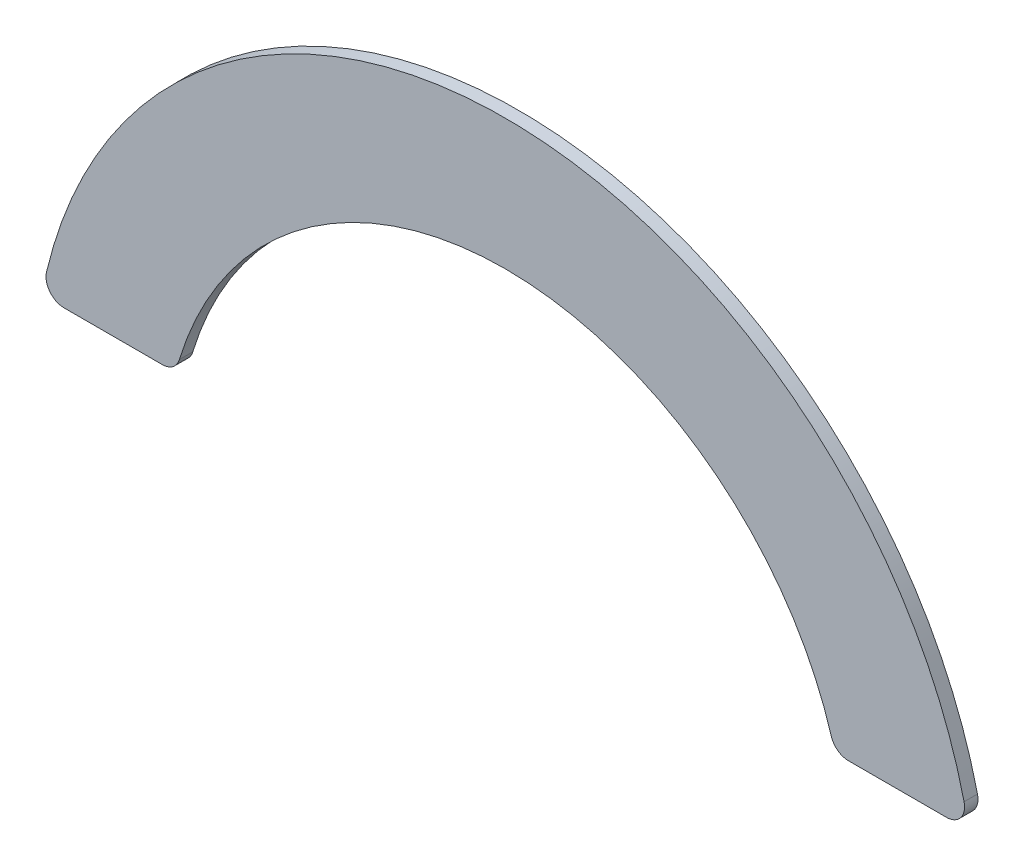
ISO-10303-21;
HEADER;
FILE_DESCRIPTION(('STEP AP214'),'2;1');
FILE_NAME('part.step','',(''),(''),'','','');
FILE_SCHEMA(('AUTOMOTIVE_DESIGN { 1 0 10303 214 1 1 1 1 }'));
ENDSEC;
DATA;
#1=APPLICATION_CONTEXT('core data for automotive mechanical design processes');
#2=APPLICATION_PROTOCOL_DEFINITION('international standard','automotive_design',2000,#1);
#3=PRODUCT_CONTEXT('',#1,'mechanical');
#4=PRODUCT('Part','Part','',(#3));
#5=PRODUCT_RELATED_PRODUCT_CATEGORY('part','',(#4));
#6=PRODUCT_DEFINITION_FORMATION('','',#4);
#7=PRODUCT_DEFINITION_CONTEXT('part definition',#1,'design');
#8=PRODUCT_DEFINITION('design','',#6,#7);
#9=PRODUCT_DEFINITION_SHAPE('','',#8);
#10=(LENGTH_UNIT() NAMED_UNIT(*) SI_UNIT(.MILLI.,.METRE.));
#11=(NAMED_UNIT(*) PLANE_ANGLE_UNIT() SI_UNIT($,.RADIAN.));
#12=(NAMED_UNIT(*) SI_UNIT($,.STERADIAN.) SOLID_ANGLE_UNIT());
#13=UNCERTAINTY_MEASURE_WITH_UNIT(LENGTH_MEASURE(1.E-05),#10,'distance_accuracy_value','');
#14=(GEOMETRIC_REPRESENTATION_CONTEXT(3) GLOBAL_UNCERTAINTY_ASSIGNED_CONTEXT((#13)) GLOBAL_UNIT_ASSIGNED_CONTEXT((#10,
#11,#12)) REPRESENTATION_CONTEXT('',''));
#15=CARTESIAN_POINT('',(0.,0.,0.));
#16=DIRECTION('',(0.,0.,1.));
#17=DIRECTION('',(1.,0.,0.));
#18=AXIS2_PLACEMENT_3D('',#15,#16,#17);
#19=CARTESIAN_POINT('',(0.,0.,0.05));
#20=DIRECTION('',(0.,0.,1.));
#21=DIRECTION('',(1.,0.,0.));
#22=AXIS2_PLACEMENT_3D('',#19,#20,#21);
#23=PLANE('',#22);
#24=DIRECTION('',(1.,0.,0.));
#25=VECTOR('',#24,1.);
#26=CARTESIAN_POINT('',(0.,0.556006,0.05));
#27=LINE('',#26,#25);
#28=CARTESIAN_POINT('',(-1.644904,0.556006000000003,0.05));
#29=VERTEX_POINT('',#28);
#30=CARTESIAN_POINT('',(-1.277874,0.556006,0.05));
#31=VERTEX_POINT('',#30);
#32=EDGE_CURVE('E85',#29,#31,#27,.T.);
#33=ORIENTED_EDGE('',*,*,#32,.T.);
#34=CARTESIAN_POINT('',(-1.27898035298,0.622788807085,0.05));
#35=DIRECTION('',(0.,0.,1.));
#36=DIRECTION('',(1.,0.,0.));
#37=AXIS2_PLACEMENT_3D('',#34,#35,#36);
#38=CIRCLE('',#37,0.06679197061828);
#39=CARTESIAN_POINT('',(-1.21488199999994,0.604011999999981,0.05));
#40=VERTEX_POINT('',#39);
#41=EDGE_CURVE('E117',#40,#31,#38,.F.);
#42=ORIENTED_EDGE('',*,*,#41,.F.);
#43=CARTESIAN_POINT('',(-0.000381,0.234721375585,0.05));
#44=DIRECTION('',(0.,0.,1.));
#45=DIRECTION('',(1.,0.,0.));
#46=AXIS2_PLACEMENT_3D('',#43,#44,#45);
#47=CIRCLE('',#46,1.269404681054);
#48=CARTESIAN_POINT('',(1.21411999999958,0.604011999999877,0.05));
#49=VERTEX_POINT('',#48);
#50=EDGE_CURVE('E116',#40,#49,#47,.F.);
#51=ORIENTED_EDGE('',*,*,#50,.T.);
#52=CARTESIAN_POINT('',(1.278147212958,0.6226954593317,0.05));
#53=DIRECTION('',(0.,0.,1.));
#54=DIRECTION('',(1.,0.,0.));
#55=AXIS2_PLACEMENT_3D('',#52,#53,#54);
#56=CIRCLE('',#55,0.06669749359479);
#57=CARTESIAN_POINT('',(1.277112,0.556006,0.05));
#58=VERTEX_POINT('',#57);
#59=EDGE_CURVE('E112',#58,#49,#56,.F.);
#60=ORIENTED_EDGE('',*,*,#59,.F.);
#61=DIRECTION('',(1.,0.,0.));
#62=VECTOR('',#61,1.);
#63=CARTESIAN_POINT('',(1.277112,0.556006,0.05));
#64=LINE('',#63,#62);
#65=CARTESIAN_POINT('',(1.643888,0.556005999999969,0.05));
#66=VERTEX_POINT('',#65);
#67=EDGE_CURVE('E109',#66,#58,#64,.F.);
#68=ORIENTED_EDGE('',*,*,#67,.F.);
#69=CARTESIAN_POINT('',(1.643465014655,0.6233189640624,0.05));
#70=DIRECTION('',(0.,0.,1.));
#71=DIRECTION('',(1.,0.,0.));
#72=AXIS2_PLACEMENT_3D('',#69,#70,#71);
#73=CIRCLE('',#72,0.06731429303999);
#74=CARTESIAN_POINT('',(1.70891200000001,0.639064000000003,0.05));
#75=VERTEX_POINT('',#74);
#76=EDGE_CURVE('E89',#75,#66,#73,.F.);
#77=ORIENTED_EDGE('',*,*,#76,.F.);
#78=CARTESIAN_POINT('',(-0.000508,0.233785187632,0.05));
#79=DIRECTION('',(0.,0.,1.));
#80=DIRECTION('',(1.,0.,0.));
#81=AXIS2_PLACEMENT_3D('',#78,#79,#80);
#82=CIRCLE('',#81,1.756806094068);
#83=CARTESIAN_POINT('',(-1.70992799999991,0.639063999999978,0.05));
#84=VERTEX_POINT('',#83);
#85=EDGE_CURVE('E87',#84,#75,#82,.F.);
#86=ORIENTED_EDGE('',*,*,#85,.F.);
#87=CARTESIAN_POINT('',(-1.644582314632,0.6232396588813,0.05));
#88=DIRECTION('',(0.,0.,1.));
#89=DIRECTION('',(1.,0.,0.));
#90=AXIS2_PLACEMENT_3D('',#87,#88,#89);
#91=CIRCLE('',#90,0.06723442844289);
#92=EDGE_CURVE('E20',#84,#29,#91,.T.);
#93=ORIENTED_EDGE('',*,*,#92,.T.);
#94=EDGE_LOOP('',(#33,#42,#51,#60,#68,#77,#86,#93));
#95=FACE_BOUND('',#94,.T.);
#96=ADVANCED_FACE('F17',(#95),#23,.T.);
#97=CARTESIAN_POINT('',(-1.27898035298,0.622788807085,0.));
#98=DIRECTION('',(0.,0.,1.));
#99=DIRECTION('',(1.,0.,0.));
#100=AXIS2_PLACEMENT_3D('',#97,#98,#99);
#101=CYLINDRICAL_SURFACE('',#100,0.06679197061828);
#102=DIRECTION('',(0.,0.,-1.));
#103=VECTOR('',#102,1.);
#104=CARTESIAN_POINT('',(-1.277874,0.556006,0.));
#105=LINE('',#104,#103);
#106=CARTESIAN_POINT('',(-1.277874,0.556005999999983,0.));
#107=VERTEX_POINT('',#106);
#108=EDGE_CURVE('E99',#107,#31,#105,.F.);
#109=ORIENTED_EDGE('',*,*,#108,.F.);
#110=CARTESIAN_POINT('',(-1.27898035298,0.622788807085,0.));
#111=DIRECTION('',(0.,0.,1.));
#112=DIRECTION('',(1.,0.,0.));
#113=AXIS2_PLACEMENT_3D('',#110,#111,#112);
#114=CIRCLE('',#113,0.06679197061828);
#115=CARTESIAN_POINT('',(-1.214882,0.604011999999998,0.));
#116=VERTEX_POINT('',#115);
#117=EDGE_CURVE('E132',#107,#116,#114,.T.);
#118=ORIENTED_EDGE('',*,*,#117,.T.);
#119=DIRECTION('',(0.,0.,1.));
#120=VECTOR('',#119,1.);
#121=CARTESIAN_POINT('',(-1.214882,0.604011999999998,0.));
#122=LINE('',#121,#120);
#123=EDGE_CURVE('E113',#116,#40,#122,.T.);
#124=ORIENTED_EDGE('',*,*,#123,.T.);
#125=ORIENTED_EDGE('',*,*,#41,.T.);
#126=EDGE_LOOP('',(#109,#118,#124,#125));
#127=FACE_BOUND('',#126,.T.);
#128=ADVANCED_FACE('F141',(#127),#101,.T.);
#129=CARTESIAN_POINT('',(-0.000381,0.234721375585,0.));
#130=DIRECTION('',(0.,0.,1.));
#131=DIRECTION('',(1.,0.,0.));
#132=AXIS2_PLACEMENT_3D('',#129,#130,#131);
#133=CYLINDRICAL_SURFACE('',#132,1.269404681054);
#134=ORIENTED_EDGE('',*,*,#50,.F.);
#135=ORIENTED_EDGE('',*,*,#123,.F.);
#136=CARTESIAN_POINT('',(-0.000381,0.234721375585,0.));
#137=DIRECTION('',(0.,0.,1.));
#138=DIRECTION('',(1.,0.,0.));
#139=AXIS2_PLACEMENT_3D('',#136,#137,#138);
#140=CIRCLE('',#139,1.269404681054);
#141=CARTESIAN_POINT('',(1.21411999999958,0.604011999999877,0.));
#142=VERTEX_POINT('',#141);
#143=EDGE_CURVE('E129',#116,#142,#140,.F.);
#144=ORIENTED_EDGE('',*,*,#143,.T.);
#145=DIRECTION('',(0.,0.,1.));
#146=VECTOR('',#145,1.);
#147=CARTESIAN_POINT('',(1.21411999999958,0.604011999999877,0.));
#148=LINE('',#147,#146);
#149=EDGE_CURVE('E110',#49,#142,#148,.F.);
#150=ORIENTED_EDGE('',*,*,#149,.F.);
#151=EDGE_LOOP('',(#134,#135,#144,#150));
#152=FACE_BOUND('',#151,.T.);
#153=ADVANCED_FACE('F151',(#152),#133,.F.);
#154=CARTESIAN_POINT('',(1.278147212958,0.6226954593317,0.));
#155=DIRECTION('',(0.,0.,1.));
#156=DIRECTION('',(1.,0.,0.));
#157=AXIS2_PLACEMENT_3D('',#154,#155,#156);
#158=CYLINDRICAL_SURFACE('',#157,0.06669749359479);
#159=ORIENTED_EDGE('',*,*,#149,.T.);
#160=CARTESIAN_POINT('',(1.278147212958,0.6226954593317,0.));
#161=DIRECTION('',(0.,0.,1.));
#162=DIRECTION('',(1.,0.,0.));
#163=AXIS2_PLACEMENT_3D('',#160,#161,#162);
#164=CIRCLE('',#163,0.06669749359479);
#165=CARTESIAN_POINT('',(1.277112,0.556006,0.));
#166=VERTEX_POINT('',#165);
#167=EDGE_CURVE('E126',#142,#166,#164,.T.);
#168=ORIENTED_EDGE('',*,*,#167,.T.);
#169=DIRECTION('',(0.,0.,-1.));
#170=VECTOR('',#169,1.);
#171=CARTESIAN_POINT('',(1.277112,0.556006,0.));
#172=LINE('',#171,#170);
#173=EDGE_CURVE('E107',#58,#166,#172,.T.);
#174=ORIENTED_EDGE('',*,*,#173,.F.);
#175=ORIENTED_EDGE('',*,*,#59,.T.);
#176=EDGE_LOOP('',(#159,#168,#174,#175));
#177=FACE_BOUND('',#176,.T.);
#178=ADVANCED_FACE('F156',(#177),#158,.T.);
#179=CARTESIAN_POINT('',(1.277112,0.556006,0.));
#180=DIRECTION('',(0.,-1.,0.));
#181=DIRECTION('',(0.,0.,-1.));
#182=AXIS2_PLACEMENT_3D('',#179,#180,#181);
#183=PLANE('',#182);
#184=ORIENTED_EDGE('',*,*,#173,.T.);
#185=DIRECTION('',(1.,0.,0.));
#186=VECTOR('',#185,1.);
#187=CARTESIAN_POINT('',(0.,0.556006,0.));
#188=LINE('',#187,#186);
#189=CARTESIAN_POINT('',(1.643888,0.556005999999969,0.));
#190=VERTEX_POINT('',#189);
#191=EDGE_CURVE('E125',#166,#190,#188,.T.);
#192=ORIENTED_EDGE('',*,*,#191,.T.);
#193=DIRECTION('',(0.,0.,1.));
#194=VECTOR('',#193,1.);
#195=CARTESIAN_POINT('',(1.643888,0.556005999999958,0.));
#196=LINE('',#195,#194);
#197=EDGE_CURVE('E93',#66,#190,#196,.F.);
#198=ORIENTED_EDGE('',*,*,#197,.F.);
#199=ORIENTED_EDGE('',*,*,#67,.T.);
#200=EDGE_LOOP('',(#184,#192,#198,#199));
#201=FACE_BOUND('',#200,.T.);
#202=ADVANCED_FACE('F159',(#201),#183,.T.);
#203=CARTESIAN_POINT('',(1.643465014655,0.6233189640624,0.));
#204=DIRECTION('',(0.,0.,1.));
#205=DIRECTION('',(1.,0.,0.));
#206=AXIS2_PLACEMENT_3D('',#203,#204,#205);
#207=CYLINDRICAL_SURFACE('',#206,0.06731429303999);
#208=ORIENTED_EDGE('',*,*,#197,.T.);
#209=CARTESIAN_POINT('',(1.643465014655,0.6233189640624,0.));
#210=DIRECTION('',(0.,0.,1.));
#211=DIRECTION('',(1.,0.,0.));
#212=AXIS2_PLACEMENT_3D('',#209,#210,#211);
#213=CIRCLE('',#212,0.06731429303999);
#214=CARTESIAN_POINT('',(1.70891200000001,0.639064000000003,0.));
#215=VERTEX_POINT('',#214);
#216=EDGE_CURVE('E122',#190,#215,#213,.T.);
#217=ORIENTED_EDGE('',*,*,#216,.T.);
#218=DIRECTION('',(0.,0.,1.));
#219=VECTOR('',#218,1.);
#220=CARTESIAN_POINT('',(1.70891200000001,0.639064000000003,0.));
#221=LINE('',#220,#219);
#222=EDGE_CURVE('E92',#75,#215,#221,.F.);
#223=ORIENTED_EDGE('',*,*,#222,.F.);
#224=ORIENTED_EDGE('',*,*,#76,.T.);
#225=EDGE_LOOP('',(#208,#217,#223,#224));
#226=FACE_BOUND('',#225,.T.);
#227=ADVANCED_FACE('F163',(#226),#207,.T.);
#228=CARTESIAN_POINT('',(-0.000508,0.233785187632,0.));
#229=DIRECTION('',(0.,0.,1.));
#230=DIRECTION('',(1.,0.,0.));
#231=AXIS2_PLACEMENT_3D('',#228,#229,#230);
#232=CYLINDRICAL_SURFACE('',#231,1.756806094068);
#233=ORIENTED_EDGE('',*,*,#222,.T.);
#234=CARTESIAN_POINT('',(-0.000508,0.233785187632,0.));
#235=DIRECTION('',(0.,0.,1.));
#236=DIRECTION('',(1.,0.,0.));
#237=AXIS2_PLACEMENT_3D('',#234,#235,#236);
#238=CIRCLE('',#237,1.756806094068);
#239=CARTESIAN_POINT('',(-1.70992799999991,0.639063999999978,0.));
#240=VERTEX_POINT('',#239);
#241=EDGE_CURVE('E98',#215,#240,#238,.T.);
#242=ORIENTED_EDGE('',*,*,#241,.T.);
#243=DIRECTION('',(0.,0.,1.));
#244=VECTOR('',#243,1.);
#245=CARTESIAN_POINT('',(-1.70992799999991,0.639063999999978,0.));
#246=LINE('',#245,#244);
#247=EDGE_CURVE('E82',#84,#240,#246,.F.);
#248=ORIENTED_EDGE('',*,*,#247,.F.);
#249=ORIENTED_EDGE('',*,*,#85,.T.);
#250=EDGE_LOOP('',(#233,#242,#248,#249));
#251=FACE_BOUND('',#250,.T.);
#252=ADVANCED_FACE('F96',(#251),#232,.T.);
#253=CARTESIAN_POINT('',(-1.644582314632,0.6232396588813,0.));
#254=DIRECTION('',(0.,0.,1.));
#255=DIRECTION('',(1.,0.,0.));
#256=AXIS2_PLACEMENT_3D('',#253,#254,#255);
#257=CYLINDRICAL_SURFACE('',#256,0.06723442844289);
#258=ORIENTED_EDGE('',*,*,#247,.T.);
#259=CARTESIAN_POINT('',(-1.644582314632,0.6232396588813,0.));
#260=DIRECTION('',(0.,0.,1.));
#261=DIRECTION('',(1.,0.,0.));
#262=AXIS2_PLACEMENT_3D('',#259,#260,#261);
#263=CIRCLE('',#262,0.06723442844289);
#264=CARTESIAN_POINT('',(-1.644904,0.556006,0.));
#265=VERTEX_POINT('',#264);
#266=EDGE_CURVE('E26',#240,#265,#263,.T.);
#267=ORIENTED_EDGE('',*,*,#266,.T.);
#268=DIRECTION('',(0.,0.,-1.));
#269=VECTOR('',#268,1.);
#270=CARTESIAN_POINT('',(-1.644904,0.556006,0.));
#271=LINE('',#270,#269);
#272=EDGE_CURVE('E34',#29,#265,#271,.T.);
#273=ORIENTED_EDGE('',*,*,#272,.F.);
#274=ORIENTED_EDGE('',*,*,#92,.F.);
#275=EDGE_LOOP('',(#258,#267,#273,#274));
#276=FACE_BOUND('',#275,.T.);
#277=ADVANCED_FACE('F79',(#276),#257,.T.);
#278=CARTESIAN_POINT('',(-1.644904,0.556006,0.));
#279=DIRECTION('',(0.,-1.,0.));
#280=DIRECTION('',(0.,0.,-1.));
#281=AXIS2_PLACEMENT_3D('',#278,#279,#280);
#282=PLANE('',#281);
#283=ORIENTED_EDGE('',*,*,#272,.T.);
#284=DIRECTION('',(1.,0.,0.));
#285=VECTOR('',#284,1.);
#286=CARTESIAN_POINT('',(0.,0.556006,0.));
#287=LINE('',#286,#285);
#288=EDGE_CURVE('E11',#265,#107,#287,.T.);
#289=ORIENTED_EDGE('',*,*,#288,.T.);
#290=ORIENTED_EDGE('',*,*,#108,.T.);
#291=ORIENTED_EDGE('',*,*,#32,.F.);
#292=EDGE_LOOP('',(#283,#289,#290,#291));
#293=FACE_BOUND('',#292,.T.);
#294=ADVANCED_FACE('F143',(#293),#282,.T.);
#295=CARTESIAN_POINT('',(0.,0.,0.));
#296=DIRECTION('',(0.,0.,1.));
#297=DIRECTION('',(1.,0.,0.));
#298=AXIS2_PLACEMENT_3D('',#295,#296,#297);
#299=PLANE('',#298);
#300=ORIENTED_EDGE('',*,*,#266,.F.);
#301=ORIENTED_EDGE('',*,*,#241,.F.);
#302=ORIENTED_EDGE('',*,*,#216,.F.);
#303=ORIENTED_EDGE('',*,*,#191,.F.);
#304=ORIENTED_EDGE('',*,*,#167,.F.);
#305=ORIENTED_EDGE('',*,*,#143,.F.);
#306=ORIENTED_EDGE('',*,*,#117,.F.);
#307=ORIENTED_EDGE('',*,*,#288,.F.);
#308=EDGE_LOOP('',(#300,#301,#302,#303,#304,#305,#306,#307));
#309=FACE_BOUND('',#308,.T.);
#310=ADVANCED_FACE('F145',(#309),#299,.F.);
#311=CLOSED_SHELL('',(#96,#128,#153,#178,#202,#227,#252,#277,#294,#310));
#312=MANIFOLD_SOLID_BREP('B1',#311);
#313=ADVANCED_BREP_SHAPE_REPRESENTATION('',(#18,#312),#14);
#314=SHAPE_DEFINITION_REPRESENTATION(#9,#313);
ENDSEC;
END-ISO-10303-21;
